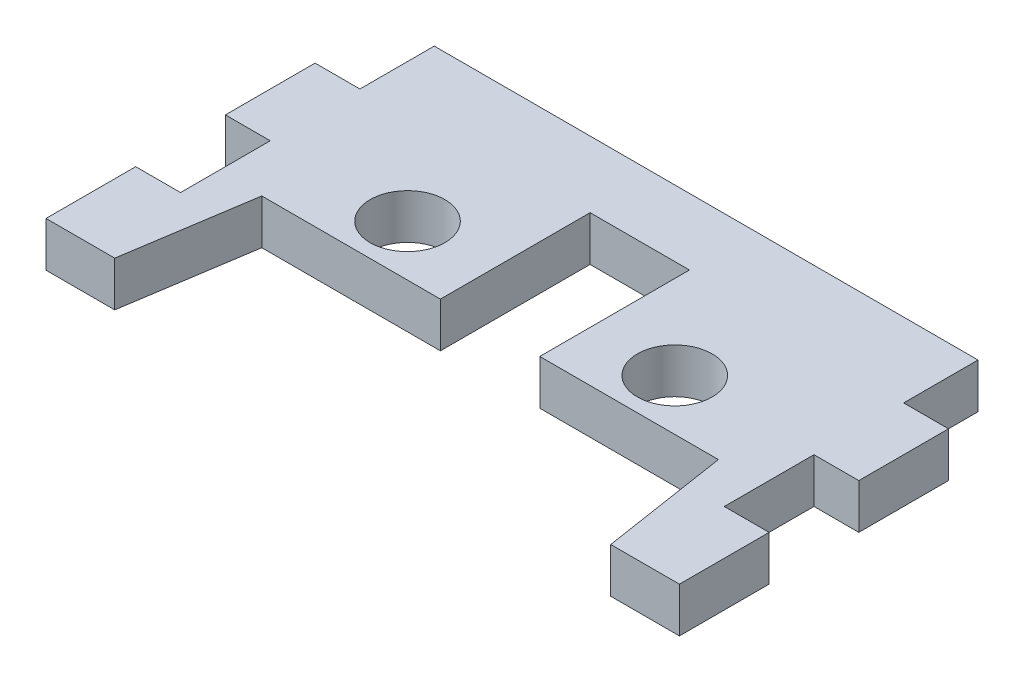
ISO-10303-21;
HEADER;
FILE_DESCRIPTION(('STEP AP214'),'2;1');
FILE_NAME('part.step','',(''),(''),'','','');
FILE_SCHEMA(('AUTOMOTIVE_DESIGN { 1 0 10303 214 1 1 1 1 }'));
ENDSEC;
DATA;
#1=APPLICATION_CONTEXT('core data for automotive mechanical design processes');
#2=APPLICATION_PROTOCOL_DEFINITION('international standard','automotive_design',2000,#1);
#3=PRODUCT_CONTEXT('',#1,'mechanical');
#4=PRODUCT('Part','Part','',(#3));
#5=PRODUCT_RELATED_PRODUCT_CATEGORY('part','',(#4));
#6=PRODUCT_DEFINITION_FORMATION('','',#4);
#7=PRODUCT_DEFINITION_CONTEXT('part definition',#1,'design');
#8=PRODUCT_DEFINITION('design','',#6,#7);
#9=PRODUCT_DEFINITION_SHAPE('','',#8);
#10=(LENGTH_UNIT() NAMED_UNIT(*) SI_UNIT(.MILLI.,.METRE.));
#11=(NAMED_UNIT(*) PLANE_ANGLE_UNIT() SI_UNIT($,.RADIAN.));
#12=(NAMED_UNIT(*) SI_UNIT($,.STERADIAN.) SOLID_ANGLE_UNIT());
#13=UNCERTAINTY_MEASURE_WITH_UNIT(LENGTH_MEASURE(1.E-05),#10,'distance_accuracy_value','');
#14=(GEOMETRIC_REPRESENTATION_CONTEXT(3) GLOBAL_UNCERTAINTY_ASSIGNED_CONTEXT((#13)) GLOBAL_UNIT_ASSIGNED_CONTEXT((#10,
#11,#12)) REPRESENTATION_CONTEXT('',''));
#15=CARTESIAN_POINT('',(0.,0.,0.));
#16=DIRECTION('',(0.,0.,1.));
#17=DIRECTION('',(1.,0.,0.));
#18=AXIS2_PLACEMENT_3D('',#15,#16,#17);
#19=CARTESIAN_POINT('',(0.,6.,0.));
#20=DIRECTION('',(0.,-1.,0.));
#21=DIRECTION('',(0.,0.,-1.));
#22=AXIS2_PLACEMENT_3D('',#19,#20,#21);
#23=PLANE('',#22);
#24=CARTESIAN_POINT('',(28.9745197224591,6.,-7.23783964696655));
#25=DIRECTION('',(0.,1.,0.));
#26=DIRECTION('',(0.,0.,1.));
#27=AXIS2_PLACEMENT_3D('',#24,#25,#26);
#28=CIRCLE('',#27,5.00000000000204);
#29=CARTESIAN_POINT('',(28.9745197224591,6.,-2.23783964696451));
#30=VERTEX_POINT('',#29);
#31=EDGE_CURVE('E232',#30,#30,#28,.T.);
#32=ORIENTED_EDGE('',*,*,#31,.F.);
#33=EDGE_LOOP('',(#32));
#34=FACE_BOUND('',#33,.T.);
#35=DIRECTION('',(0.152822724540484,0.,-0.988253618695132));
#36=VECTOR('',#35,1.);
#37=CARTESIAN_POINT('',(16.3085223788737,6.,-0.405693797705775));
#38=LINE('',#37,#36);
#39=CARTESIAN_POINT('',(13.6732789683899,6.,16.6355469234228));
#40=VERTEX_POINT('',#39);
#41=CARTESIAN_POINT('',(16.3085223788737,6.,-0.405693797705775));
#42=VERTEX_POINT('',#41);
#43=EDGE_CURVE('E275',#40,#42,#38,.T.);
#44=ORIENTED_EDGE('',*,*,#43,.T.);
#45=DIRECTION('',(1.,0.,0.));
#46=VECTOR('',#45,1.);
#47=CARTESIAN_POINT('',(40.2068590818868,6.,-0.405693797705778));
#48=LINE('',#47,#46);
#49=CARTESIAN_POINT('',(40.2068590818868,6.,-0.405693797705778));
#50=VERTEX_POINT('',#49);
#51=EDGE_CURVE('E143',#42,#50,#48,.T.);
#52=ORIENTED_EDGE('',*,*,#51,.T.);
#53=DIRECTION('',(0.,0.,-1.));
#54=VECTOR('',#53,1.);
#55=CARTESIAN_POINT('',(40.2068590818868,6.,-0.405693797705778));
#56=LINE('',#55,#54);
#57=CARTESIAN_POINT('',(40.2068590818868,6.,-20.432362651178));
#58=VERTEX_POINT('',#57);
#59=EDGE_CURVE('E338',#50,#58,#56,.T.);
#60=ORIENTED_EDGE('',*,*,#59,.T.);
#61=DIRECTION('',(1.,0.,0.));
#62=VECTOR('',#61,1.);
#63=CARTESIAN_POINT('',(40.2068590818868,6.,-20.432362651178));
#64=LINE('',#63,#62);
#65=CARTESIAN_POINT('',(53.4967784330314,6.,-20.432362651178));
#66=VERTEX_POINT('',#65);
#67=EDGE_CURVE('E357',#58,#66,#64,.T.);
#68=ORIENTED_EDGE('',*,*,#67,.T.);
#69=DIRECTION('',(0.,0.,1.));
#70=VECTOR('',#69,1.);
#71=CARTESIAN_POINT('',(53.4967784330314,6.,-0.405693797705778));
#72=LINE('',#71,#70);
#73=CARTESIAN_POINT('',(53.4967784330314,6.,-0.405693797705778));
#74=VERTEX_POINT('',#73);
#75=EDGE_CURVE('E354',#66,#74,#72,.T.);
#76=ORIENTED_EDGE('',*,*,#75,.T.);
#77=DIRECTION('',(1.,0.,0.));
#78=VECTOR('',#77,1.);
#79=CARTESIAN_POINT('',(77.3951151360445,6.,-0.405693797705775));
#80=LINE('',#79,#78);
#81=CARTESIAN_POINT('',(77.3951151360445,6.,-0.405693797705775));
#82=VERTEX_POINT('',#81);
#83=EDGE_CURVE('E356',#74,#82,#80,.T.);
#84=ORIENTED_EDGE('',*,*,#83,.T.);
#85=DIRECTION('',(0.152822724540484,0.,0.988253618695132));
#86=VECTOR('',#85,1.);
#87=CARTESIAN_POINT('',(80.0303585465283,6.,16.6355469234228));
#88=LINE('',#87,#86);
#89=CARTESIAN_POINT('',(80.0303585465283,6.,16.6355469234228));
#90=VERTEX_POINT('',#89);
#91=EDGE_CURVE('E359',#82,#90,#88,.T.);
#92=ORIENTED_EDGE('',*,*,#91,.T.);
#93=DIRECTION('',(1.,0.,0.));
#94=VECTOR('',#93,1.);
#95=CARTESIAN_POINT('',(89.2254004324377,6.,16.6355469234228));
#96=LINE('',#95,#94);
#97=CARTESIAN_POINT('',(89.2254004324377,6.,16.6355469234228));
#98=VERTEX_POINT('',#97);
#99=EDGE_CURVE('E365',#90,#98,#96,.T.);
#100=ORIENTED_EDGE('',*,*,#99,.T.);
#101=DIRECTION('',(0.,0.,-1.));
#102=VECTOR('',#101,1.);
#103=CARTESIAN_POINT('',(89.2254004324377,6.,4.63554692342285));
#104=LINE('',#103,#102);
#105=CARTESIAN_POINT('',(89.2254004324377,6.,4.63554692342285));
#106=VERTEX_POINT('',#105);
#107=EDGE_CURVE('E367',#98,#106,#104,.T.);
#108=ORIENTED_EDGE('',*,*,#107,.T.);
#109=DIRECTION('',(-1.,0.,0.));
#110=VECTOR('',#109,1.);
#111=CARTESIAN_POINT('',(83.2254004324591,6.,4.63554692342285));
#112=LINE('',#111,#110);
#113=CARTESIAN_POINT('',(83.2254004324591,6.,4.63554692342285));
#114=VERTEX_POINT('',#113);
#115=EDGE_CURVE('E369',#106,#114,#112,.T.);
#116=ORIENTED_EDGE('',*,*,#115,.T.);
#117=DIRECTION('',(0.,0.,-1.));
#118=VECTOR('',#117,1.);
#119=CARTESIAN_POINT('',(83.2254004324591,6.,-7.36445307657716));
#120=LINE('',#119,#118);
#121=CARTESIAN_POINT('',(83.2254004324591,6.,-7.36445307657716));
#122=VERTEX_POINT('',#121);
#123=EDGE_CURVE('E371',#114,#122,#120,.T.);
#124=ORIENTED_EDGE('',*,*,#123,.T.);
#125=DIRECTION('',(1.,0.,0.));
#126=VECTOR('',#125,1.);
#127=CARTESIAN_POINT('',(89.2254004324377,6.,-7.36445307657716));
#128=LINE('',#127,#126);
#129=CARTESIAN_POINT('',(89.2254004324377,6.,-7.36445307657716));
#130=VERTEX_POINT('',#129);
#131=EDGE_CURVE('E373',#122,#130,#128,.T.);
#132=ORIENTED_EDGE('',*,*,#131,.T.);
#133=DIRECTION('',(0.,0.,-1.));
#134=VECTOR('',#133,1.);
#135=CARTESIAN_POINT('',(89.2254004324377,6.,-7.36445307657716));
#136=LINE('',#135,#134);
#137=CARTESIAN_POINT('',(89.2254004324377,6.,-19.3644530765772));
#138=VERTEX_POINT('',#137);
#139=EDGE_CURVE('E375',#130,#138,#136,.T.);
#140=ORIENTED_EDGE('',*,*,#139,.T.);
#141=DIRECTION('',(-1.,0.,0.));
#142=VECTOR('',#141,1.);
#143=CARTESIAN_POINT('',(89.2254004324377,6.,-19.3644530765772));
#144=LINE('',#143,#142);
#145=CARTESIAN_POINT('',(83.2254004324591,6.,-19.3644530765772));
#146=VERTEX_POINT('',#145);
#147=EDGE_CURVE('E377',#138,#146,#144,.T.);
#148=ORIENTED_EDGE('',*,*,#147,.T.);
#149=DIRECTION('',(0.,0.,-1.));
#150=VECTOR('',#149,1.);
#151=CARTESIAN_POINT('',(83.2254004324591,6.,-19.3644530765772));
#152=LINE('',#151,#150);
#153=CARTESIAN_POINT('',(83.2254004324591,6.,-29.3111134765772));
#154=VERTEX_POINT('',#153);
#155=EDGE_CURVE('E379',#146,#154,#152,.T.);
#156=ORIENTED_EDGE('',*,*,#155,.T.);
#157=DIRECTION('',(-1.,0.,0.));
#158=VECTOR('',#157,1.);
#159=CARTESIAN_POINT('',(10.4782370824591,6.,-29.3111134765772));
#160=LINE('',#159,#158);
#161=CARTESIAN_POINT('',(10.4782370824591,6.,-29.3111134765772));
#162=VERTEX_POINT('',#161);
#163=EDGE_CURVE('E381',#154,#162,#160,.T.);
#164=ORIENTED_EDGE('',*,*,#163,.T.);
#165=DIRECTION('',(0.,0.,1.));
#166=VECTOR('',#165,1.);
#167=CARTESIAN_POINT('',(10.4782370824591,6.,-19.3644530765772));
#168=LINE('',#167,#166);
#169=CARTESIAN_POINT('',(10.4782370824591,6.,-19.3644530765772));
#170=VERTEX_POINT('',#169);
#171=EDGE_CURVE('E383',#162,#170,#168,.T.);
#172=ORIENTED_EDGE('',*,*,#171,.T.);
#173=DIRECTION('',(-1.,0.,0.));
#174=VECTOR('',#173,1.);
#175=CARTESIAN_POINT('',(4.47823708248052,6.,-19.3644530765772));
#176=LINE('',#175,#174);
#177=CARTESIAN_POINT('',(4.47823708248052,6.,-19.3644530765772));
#178=VERTEX_POINT('',#177);
#179=EDGE_CURVE('E385',#170,#178,#176,.T.);
#180=ORIENTED_EDGE('',*,*,#179,.T.);
#181=DIRECTION('',(0.,0.,1.));
#182=VECTOR('',#181,1.);
#183=CARTESIAN_POINT('',(4.47823708248052,6.,-7.36445307657715));
#184=LINE('',#183,#182);
#185=CARTESIAN_POINT('',(4.47823708248052,6.,-7.36445307657715));
#186=VERTEX_POINT('',#185);
#187=EDGE_CURVE('E387',#178,#186,#184,.T.);
#188=ORIENTED_EDGE('',*,*,#187,.T.);
#189=DIRECTION('',(1.,0.,0.));
#190=VECTOR('',#189,1.);
#191=CARTESIAN_POINT('',(10.4782370824591,6.,-7.36445307657715));
#192=LINE('',#191,#190);
#193=CARTESIAN_POINT('',(10.4782370824591,6.,-7.36445307657715));
#194=VERTEX_POINT('',#193);
#195=EDGE_CURVE('E389',#186,#194,#192,.T.);
#196=ORIENTED_EDGE('',*,*,#195,.T.);
#197=DIRECTION('',(0.,0.,1.));
#198=VECTOR('',#197,1.);
#199=CARTESIAN_POINT('',(10.4782370824591,6.,4.63554692342285));
#200=LINE('',#199,#198);
#201=CARTESIAN_POINT('',(10.4782370824591,6.,4.63554692342285));
#202=VERTEX_POINT('',#201);
#203=EDGE_CURVE('E210',#194,#202,#200,.T.);
#204=ORIENTED_EDGE('',*,*,#203,.T.);
#205=DIRECTION('',(-1.,0.,0.));
#206=VECTOR('',#205,1.);
#207=CARTESIAN_POINT('',(4.47823708248052,6.,4.63554692342285));
#208=LINE('',#207,#206);
#209=CARTESIAN_POINT('',(4.47823708248052,6.,4.63554692342285));
#210=VERTEX_POINT('',#209);
#211=EDGE_CURVE('E204',#202,#210,#208,.T.);
#212=ORIENTED_EDGE('',*,*,#211,.T.);
#213=DIRECTION('',(0.,0.,1.));
#214=VECTOR('',#213,1.);
#215=CARTESIAN_POINT('',(4.47823708248052,6.,16.6355469234228));
#216=LINE('',#215,#214);
#217=CARTESIAN_POINT('',(4.47823708248052,6.,16.6355469234228));
#218=VERTEX_POINT('',#217);
#219=EDGE_CURVE('E208',#210,#218,#216,.T.);
#220=ORIENTED_EDGE('',*,*,#219,.T.);
#221=DIRECTION('',(1.,0.,0.));
#222=VECTOR('',#221,1.);
#223=CARTESIAN_POINT('',(13.6732789683899,6.,16.6355469234228));
#224=LINE('',#223,#222);
#225=EDGE_CURVE('E52',#218,#40,#224,.T.);
#226=ORIENTED_EDGE('',*,*,#225,.T.);
#227=EDGE_LOOP('',(#44,#52,#60,#68,#76,#84,#92,#100,#108,#116,#124,#132,#140,#148,#156,#164,
#172,#180,#188,#196,#204,#212,#220,#226));
#228=FACE_BOUND('',#227,.T.);
#229=CARTESIAN_POINT('',(64.7291177924591,6.,-7.23783964696655));
#230=DIRECTION('',(0.,1.,0.));
#231=DIRECTION('',(0.,0.,1.));
#232=AXIS2_PLACEMENT_3D('',#229,#230,#231);
#233=CIRCLE('',#232,5.00000000000205);
#234=CARTESIAN_POINT('',(64.7291177924591,6.,-2.2378396469645));
#235=VERTEX_POINT('',#234);
#236=EDGE_CURVE('E432',#235,#235,#233,.T.);
#237=ORIENTED_EDGE('',*,*,#236,.F.);
#238=EDGE_LOOP('',(#237));
#239=FACE_BOUND('',#238,.T.);
#240=ADVANCED_FACE('F35',(#34,#228,#239),#23,.F.);
#241=CARTESIAN_POINT('',(0.,0.,0.));
#242=DIRECTION('',(0.,-1.,0.));
#243=DIRECTION('',(0.,0.,-1.));
#244=AXIS2_PLACEMENT_3D('',#241,#242,#243);
#245=PLANE('',#244);
#246=CARTESIAN_POINT('',(28.9745197224591,0.,-7.23783964696655));
#247=DIRECTION('',(0.,1.,0.));
#248=DIRECTION('',(0.,0.,1.));
#249=AXIS2_PLACEMENT_3D('',#246,#247,#248);
#250=CIRCLE('',#249,5.00000000000204);
#251=CARTESIAN_POINT('',(28.9745197224591,0.,-2.23783964696451));
#252=VERTEX_POINT('',#251);
#253=EDGE_CURVE('E437',#252,#252,#250,.T.);
#254=ORIENTED_EDGE('',*,*,#253,.T.);
#255=EDGE_LOOP('',(#254));
#256=FACE_BOUND('',#255,.T.);
#257=DIRECTION('',(0.152822724540484,0.,-0.988253618695132));
#258=VECTOR('',#257,1.);
#259=CARTESIAN_POINT('',(16.3085223788737,0.,-0.405693797705775));
#260=LINE('',#259,#258);
#261=CARTESIAN_POINT('',(13.6732789683899,0.,16.6355469234228));
#262=VERTEX_POINT('',#261);
#263=CARTESIAN_POINT('',(16.3085223788737,0.,-0.405693797705775));
#264=VERTEX_POINT('',#263);
#265=EDGE_CURVE('E228',#262,#264,#260,.T.);
#266=ORIENTED_EDGE('',*,*,#265,.F.);
#267=DIRECTION('',(1.,0.,0.));
#268=VECTOR('',#267,1.);
#269=CARTESIAN_POINT('',(13.6732789683899,0.,16.6355469234228));
#270=LINE('',#269,#268);
#271=CARTESIAN_POINT('',(4.47823708248052,0.,16.6355469234228));
#272=VERTEX_POINT('',#271);
#273=EDGE_CURVE('E135',#272,#262,#270,.T.);
#274=ORIENTED_EDGE('',*,*,#273,.F.);
#275=DIRECTION('',(0.,0.,1.));
#276=VECTOR('',#275,1.);
#277=CARTESIAN_POINT('',(4.47823708248052,0.,16.6355469234228));
#278=LINE('',#277,#276);
#279=CARTESIAN_POINT('',(4.47823708248052,0.,4.63554692342285));
#280=VERTEX_POINT('',#279);
#281=EDGE_CURVE('E129',#280,#272,#278,.T.);
#282=ORIENTED_EDGE('',*,*,#281,.F.);
#283=DIRECTION('',(-1.,0.,0.));
#284=VECTOR('',#283,1.);
#285=CARTESIAN_POINT('',(4.47823708248052,0.,4.63554692342285));
#286=LINE('',#285,#284);
#287=CARTESIAN_POINT('',(10.4782370824591,0.,4.63554692342285));
#288=VERTEX_POINT('',#287);
#289=EDGE_CURVE('E218',#288,#280,#286,.T.);
#290=ORIENTED_EDGE('',*,*,#289,.F.);
#291=DIRECTION('',(0.,0.,1.));
#292=VECTOR('',#291,1.);
#293=CARTESIAN_POINT('',(10.4782370824591,0.,4.63554692342285));
#294=LINE('',#293,#292);
#295=CARTESIAN_POINT('',(10.4782370824591,0.,-7.36445307657715));
#296=VERTEX_POINT('',#295);
#297=EDGE_CURVE('E270',#296,#288,#294,.T.);
#298=ORIENTED_EDGE('',*,*,#297,.F.);
#299=DIRECTION('',(1.,0.,0.));
#300=VECTOR('',#299,1.);
#301=CARTESIAN_POINT('',(10.4782370824591,0.,-7.36445307657715));
#302=LINE('',#301,#300);
#303=CARTESIAN_POINT('',(4.47823708248052,0.,-7.36445307657715));
#304=VERTEX_POINT('',#303);
#305=EDGE_CURVE('E268',#304,#296,#302,.T.);
#306=ORIENTED_EDGE('',*,*,#305,.F.);
#307=DIRECTION('',(0.,0.,1.));
#308=VECTOR('',#307,1.);
#309=CARTESIAN_POINT('',(4.47823708248052,0.,-7.36445307657715));
#310=LINE('',#309,#308);
#311=CARTESIAN_POINT('',(4.47823708248052,0.,-19.3644530765772));
#312=VERTEX_POINT('',#311);
#313=EDGE_CURVE('E266',#312,#304,#310,.T.);
#314=ORIENTED_EDGE('',*,*,#313,.F.);
#315=DIRECTION('',(-1.,0.,0.));
#316=VECTOR('',#315,1.);
#317=CARTESIAN_POINT('',(4.47823708248052,0.,-19.3644530765772));
#318=LINE('',#317,#316);
#319=CARTESIAN_POINT('',(10.4782370824591,0.,-19.3644530765772));
#320=VERTEX_POINT('',#319);
#321=EDGE_CURVE('E264',#320,#312,#318,.T.);
#322=ORIENTED_EDGE('',*,*,#321,.F.);
#323=DIRECTION('',(0.,0.,1.));
#324=VECTOR('',#323,1.);
#325=CARTESIAN_POINT('',(10.4782370824591,0.,-19.3644530765772));
#326=LINE('',#325,#324);
#327=CARTESIAN_POINT('',(10.4782370824591,0.,-29.3111134765772));
#328=VERTEX_POINT('',#327);
#329=EDGE_CURVE('E262',#328,#320,#326,.T.);
#330=ORIENTED_EDGE('',*,*,#329,.F.);
#331=DIRECTION('',(-1.,0.,0.));
#332=VECTOR('',#331,1.);
#333=CARTESIAN_POINT('',(10.4782370824591,0.,-29.3111134765772));
#334=LINE('',#333,#332);
#335=CARTESIAN_POINT('',(83.2254004324591,0.,-29.3111134765772));
#336=VERTEX_POINT('',#335);
#337=EDGE_CURVE('E260',#336,#328,#334,.T.);
#338=ORIENTED_EDGE('',*,*,#337,.F.);
#339=DIRECTION('',(0.,0.,-1.));
#340=VECTOR('',#339,1.);
#341=CARTESIAN_POINT('',(83.2254004324591,0.,-19.3644530765772));
#342=LINE('',#341,#340);
#343=CARTESIAN_POINT('',(83.2254004324591,0.,-19.3644530765772));
#344=VERTEX_POINT('',#343);
#345=EDGE_CURVE('E258',#344,#336,#342,.T.);
#346=ORIENTED_EDGE('',*,*,#345,.F.);
#347=DIRECTION('',(-1.,0.,0.));
#348=VECTOR('',#347,1.);
#349=CARTESIAN_POINT('',(89.2254004324377,0.,-19.3644530765772));
#350=LINE('',#349,#348);
#351=CARTESIAN_POINT('',(89.2254004324377,0.,-19.3644530765772));
#352=VERTEX_POINT('',#351);
#353=EDGE_CURVE('E256',#352,#344,#350,.T.);
#354=ORIENTED_EDGE('',*,*,#353,.F.);
#355=DIRECTION('',(0.,0.,-1.));
#356=VECTOR('',#355,1.);
#357=CARTESIAN_POINT('',(89.2254004324377,0.,-7.36445307657716));
#358=LINE('',#357,#356);
#359=CARTESIAN_POINT('',(89.2254004324377,0.,-7.36445307657716));
#360=VERTEX_POINT('',#359);
#361=EDGE_CURVE('E254',#360,#352,#358,.T.);
#362=ORIENTED_EDGE('',*,*,#361,.F.);
#363=DIRECTION('',(1.,0.,0.));
#364=VECTOR('',#363,1.);
#365=CARTESIAN_POINT('',(89.2254004324377,0.,-7.36445307657716));
#366=LINE('',#365,#364);
#367=CARTESIAN_POINT('',(83.2254004324591,0.,-7.36445307657716));
#368=VERTEX_POINT('',#367);
#369=EDGE_CURVE('E252',#368,#360,#366,.T.);
#370=ORIENTED_EDGE('',*,*,#369,.F.);
#371=DIRECTION('',(0.,0.,-1.));
#372=VECTOR('',#371,1.);
#373=CARTESIAN_POINT('',(83.2254004324591,0.,-7.36445307657716));
#374=LINE('',#373,#372);
#375=CARTESIAN_POINT('',(83.2254004324591,0.,4.63554692342285));
#376=VERTEX_POINT('',#375);
#377=EDGE_CURVE('E250',#376,#368,#374,.T.);
#378=ORIENTED_EDGE('',*,*,#377,.F.);
#379=DIRECTION('',(-1.,0.,0.));
#380=VECTOR('',#379,1.);
#381=CARTESIAN_POINT('',(83.2254004324591,0.,4.63554692342285));
#382=LINE('',#381,#380);
#383=CARTESIAN_POINT('',(89.2254004324377,0.,4.63554692342285));
#384=VERTEX_POINT('',#383);
#385=EDGE_CURVE('E248',#384,#376,#382,.T.);
#386=ORIENTED_EDGE('',*,*,#385,.F.);
#387=DIRECTION('',(0.,0.,-1.));
#388=VECTOR('',#387,1.);
#389=CARTESIAN_POINT('',(89.2254004324377,0.,4.63554692342285));
#390=LINE('',#389,#388);
#391=CARTESIAN_POINT('',(89.2254004324377,0.,16.6355469234228));
#392=VERTEX_POINT('',#391);
#393=EDGE_CURVE('E246',#392,#384,#390,.T.);
#394=ORIENTED_EDGE('',*,*,#393,.F.);
#395=DIRECTION('',(1.,0.,0.));
#396=VECTOR('',#395,1.);
#397=CARTESIAN_POINT('',(89.2254004324377,0.,16.6355469234228));
#398=LINE('',#397,#396);
#399=CARTESIAN_POINT('',(80.0303585465283,0.,16.6355469234228));
#400=VERTEX_POINT('',#399);
#401=EDGE_CURVE('E244',#400,#392,#398,.T.);
#402=ORIENTED_EDGE('',*,*,#401,.F.);
#403=DIRECTION('',(0.152822724540484,0.,0.988253618695132));
#404=VECTOR('',#403,1.);
#405=CARTESIAN_POINT('',(80.0303585465283,0.,16.6355469234228));
#406=LINE('',#405,#404);
#407=CARTESIAN_POINT('',(77.3951151360445,0.,-0.405693797705775));
#408=VERTEX_POINT('',#407);
#409=EDGE_CURVE('E242',#408,#400,#406,.T.);
#410=ORIENTED_EDGE('',*,*,#409,.F.);
#411=DIRECTION('',(1.,0.,0.));
#412=VECTOR('',#411,1.);
#413=CARTESIAN_POINT('',(77.3951151360445,0.,-0.405693797705775));
#414=LINE('',#413,#412);
#415=CARTESIAN_POINT('',(53.4967784330314,0.,-0.405693797705778));
#416=VERTEX_POINT('',#415);
#417=EDGE_CURVE('E240',#416,#408,#414,.T.);
#418=ORIENTED_EDGE('',*,*,#417,.F.);
#419=DIRECTION('',(0.,0.,1.));
#420=VECTOR('',#419,1.);
#421=CARTESIAN_POINT('',(53.4967784330314,0.,-0.405693797705778));
#422=LINE('',#421,#420);
#423=CARTESIAN_POINT('',(53.4967784330314,0.,-20.432362651178));
#424=VERTEX_POINT('',#423);
#425=EDGE_CURVE('E238',#424,#416,#422,.T.);
#426=ORIENTED_EDGE('',*,*,#425,.F.);
#427=DIRECTION('',(1.,0.,0.));
#428=VECTOR('',#427,1.);
#429=CARTESIAN_POINT('',(40.2068590818868,0.,-20.432362651178));
#430=LINE('',#429,#428);
#431=CARTESIAN_POINT('',(40.2068590818868,0.,-20.432362651178));
#432=VERTEX_POINT('',#431);
#433=EDGE_CURVE('E236',#432,#424,#430,.T.);
#434=ORIENTED_EDGE('',*,*,#433,.F.);
#435=DIRECTION('',(0.,0.,-1.));
#436=VECTOR('',#435,1.);
#437=CARTESIAN_POINT('',(40.2068590818868,0.,-0.405693797705778));
#438=LINE('',#437,#436);
#439=CARTESIAN_POINT('',(40.2068590818868,0.,-0.405693797705778));
#440=VERTEX_POINT('',#439);
#441=EDGE_CURVE('E234',#440,#432,#438,.T.);
#442=ORIENTED_EDGE('',*,*,#441,.F.);
#443=DIRECTION('',(1.,0.,0.));
#444=VECTOR('',#443,1.);
#445=CARTESIAN_POINT('',(40.2068590818868,0.,-0.405693797705778));
#446=LINE('',#445,#444);
#447=EDGE_CURVE('E231',#264,#440,#446,.T.);
#448=ORIENTED_EDGE('',*,*,#447,.F.);
#449=EDGE_LOOP('',(#266,#274,#282,#290,#298,#306,#314,#322,#330,#338,#346,#354,#362,#370,#378,
#386,#394,#402,#410,#418,#426,#434,#442,#448));
#450=FACE_BOUND('',#449,.T.);
#451=CARTESIAN_POINT('',(64.7291177924591,0.,-7.23783964696655));
#452=DIRECTION('',(0.,1.,0.));
#453=DIRECTION('',(0.,0.,1.));
#454=AXIS2_PLACEMENT_3D('',#451,#452,#453);
#455=CIRCLE('',#454,5.00000000000205);
#456=CARTESIAN_POINT('',(64.7291177924591,0.,-2.2378396469645));
#457=VERTEX_POINT('',#456);
#458=EDGE_CURVE('E435',#457,#457,#455,.T.);
#459=ORIENTED_EDGE('',*,*,#458,.T.);
#460=EDGE_LOOP('',(#459));
#461=FACE_BOUND('',#460,.T.);
#462=ADVANCED_FACE('F342',(#256,#450,#461),#245,.T.);
#463=CARTESIAN_POINT('',(16.3085223788737,6.,-0.405693797705775));
#464=DIRECTION('',(-0.988253618695132,0.,-0.152822724540484));
#465=DIRECTION('',(-0.152822724540484,0.,0.988253618695132));
#466=AXIS2_PLACEMENT_3D('',#463,#464,#465);
#467=PLANE('',#466);
#468=ORIENTED_EDGE('',*,*,#265,.T.);
#469=DIRECTION('',(0.,-1.,0.));
#470=VECTOR('',#469,1.);
#471=CARTESIAN_POINT('',(16.3085223788737,6.,-0.405693797705775));
#472=LINE('',#471,#470);
#473=EDGE_CURVE('E11',#42,#264,#472,.T.);
#474=ORIENTED_EDGE('',*,*,#473,.F.);
#475=ORIENTED_EDGE('',*,*,#43,.F.);
#476=DIRECTION('',(0.,-1.,0.));
#477=VECTOR('',#476,1.);
#478=CARTESIAN_POINT('',(13.6732789683899,6.,16.6355469234228));
#479=LINE('',#478,#477);
#480=EDGE_CURVE('E224',#40,#262,#479,.T.);
#481=ORIENTED_EDGE('',*,*,#480,.T.);
#482=EDGE_LOOP('',(#468,#474,#475,#481));
#483=FACE_BOUND('',#482,.T.);
#484=ADVANCED_FACE('F37',(#483),#467,.F.);
#485=CARTESIAN_POINT('',(40.2068590818868,6.,-0.405693797705778));
#486=DIRECTION('',(0.,0.,-1.));
#487=DIRECTION('',(-1.,0.,0.));
#488=AXIS2_PLACEMENT_3D('',#485,#486,#487);
#489=PLANE('',#488);
#490=ORIENTED_EDGE('',*,*,#447,.T.);
#491=DIRECTION('',(0.,-1.,0.));
#492=VECTOR('',#491,1.);
#493=CARTESIAN_POINT('',(40.2068590818868,6.,-0.405693797705778));
#494=LINE('',#493,#492);
#495=EDGE_CURVE('E44',#50,#440,#494,.T.);
#496=ORIENTED_EDGE('',*,*,#495,.F.);
#497=ORIENTED_EDGE('',*,*,#51,.F.);
#498=ORIENTED_EDGE('',*,*,#473,.T.);
#499=EDGE_LOOP('',(#490,#496,#497,#498));
#500=FACE_BOUND('',#499,.T.);
#501=ADVANCED_FACE('F650',(#500),#489,.F.);
#502=CARTESIAN_POINT('',(40.2068590818868,6.,-0.405693797705778));
#503=DIRECTION('',(-1.,0.,0.));
#504=DIRECTION('',(0.,0.,1.));
#505=AXIS2_PLACEMENT_3D('',#502,#503,#504);
#506=PLANE('',#505);
#507=ORIENTED_EDGE('',*,*,#441,.T.);
#508=DIRECTION('',(0.,-1.,0.));
#509=VECTOR('',#508,1.);
#510=CARTESIAN_POINT('',(40.2068590818868,6.,-20.432362651178));
#511=LINE('',#510,#509);
#512=EDGE_CURVE('E330',#58,#432,#511,.T.);
#513=ORIENTED_EDGE('',*,*,#512,.F.);
#514=ORIENTED_EDGE('',*,*,#59,.F.);
#515=ORIENTED_EDGE('',*,*,#495,.T.);
#516=EDGE_LOOP('',(#507,#513,#514,#515));
#517=FACE_BOUND('',#516,.T.);
#518=ADVANCED_FACE('F336',(#517),#506,.F.);
#519=CARTESIAN_POINT('',(40.2068590818868,6.,-20.432362651178));
#520=DIRECTION('',(0.,0.,-1.));
#521=DIRECTION('',(-1.,0.,0.));
#522=AXIS2_PLACEMENT_3D('',#519,#520,#521);
#523=PLANE('',#522);
#524=ORIENTED_EDGE('',*,*,#433,.T.);
#525=DIRECTION('',(0.,-1.,0.));
#526=VECTOR('',#525,1.);
#527=CARTESIAN_POINT('',(53.4967784330314,6.,-20.432362651178));
#528=LINE('',#527,#526);
#529=EDGE_CURVE('E327',#66,#424,#528,.T.);
#530=ORIENTED_EDGE('',*,*,#529,.F.);
#531=ORIENTED_EDGE('',*,*,#67,.F.);
#532=ORIENTED_EDGE('',*,*,#512,.T.);
#533=EDGE_LOOP('',(#524,#530,#531,#532));
#534=FACE_BOUND('',#533,.T.);
#535=ADVANCED_FACE('F348',(#534),#523,.F.);
#536=CARTESIAN_POINT('',(53.4967784330314,6.,-0.405693797705778));
#537=DIRECTION('',(1.,0.,0.));
#538=DIRECTION('',(0.,0.,-1.));
#539=AXIS2_PLACEMENT_3D('',#536,#537,#538);
#540=PLANE('',#539);
#541=ORIENTED_EDGE('',*,*,#425,.T.);
#542=DIRECTION('',(0.,-1.,0.));
#543=VECTOR('',#542,1.);
#544=CARTESIAN_POINT('',(53.4967784330314,6.,-0.405693797705778));
#545=LINE('',#544,#543);
#546=EDGE_CURVE('E324',#74,#416,#545,.T.);
#547=ORIENTED_EDGE('',*,*,#546,.F.);
#548=ORIENTED_EDGE('',*,*,#75,.F.);
#549=ORIENTED_EDGE('',*,*,#529,.T.);
#550=EDGE_LOOP('',(#541,#547,#548,#549));
#551=FACE_BOUND('',#550,.T.);
#552=ADVANCED_FACE('F352',(#551),#540,.F.);
#553=CARTESIAN_POINT('',(77.3951151360445,6.,-0.405693797705775));
#554=DIRECTION('',(0.,0.,-1.));
#555=DIRECTION('',(-1.,0.,0.));
#556=AXIS2_PLACEMENT_3D('',#553,#554,#555);
#557=PLANE('',#556);
#558=ORIENTED_EDGE('',*,*,#417,.T.);
#559=DIRECTION('',(0.,-1.,0.));
#560=VECTOR('',#559,1.);
#561=CARTESIAN_POINT('',(77.3951151360445,6.,-0.405693797705775));
#562=LINE('',#561,#560);
#563=EDGE_CURVE('E321',#82,#408,#562,.T.);
#564=ORIENTED_EDGE('',*,*,#563,.F.);
#565=ORIENTED_EDGE('',*,*,#83,.F.);
#566=ORIENTED_EDGE('',*,*,#546,.T.);
#567=EDGE_LOOP('',(#558,#564,#565,#566));
#568=FACE_BOUND('',#567,.T.);
#569=ADVANCED_FACE('F615',(#568),#557,.F.);
#570=CARTESIAN_POINT('',(80.0303585465283,6.,16.6355469234228));
#571=DIRECTION('',(0.988253618695132,0.,-0.152822724540484));
#572=DIRECTION('',(-0.152822724540484,0.,-0.988253618695132));
#573=AXIS2_PLACEMENT_3D('',#570,#571,#572);
#574=PLANE('',#573);
#575=ORIENTED_EDGE('',*,*,#409,.T.);
#576=DIRECTION('',(0.,-1.,0.));
#577=VECTOR('',#576,1.);
#578=CARTESIAN_POINT('',(80.0303585465283,6.,16.6355469234228));
#579=LINE('',#578,#577);
#580=EDGE_CURVE('E318',#90,#400,#579,.T.);
#581=ORIENTED_EDGE('',*,*,#580,.F.);
#582=ORIENTED_EDGE('',*,*,#91,.F.);
#583=ORIENTED_EDGE('',*,*,#563,.T.);
#584=EDGE_LOOP('',(#575,#581,#582,#583));
#585=FACE_BOUND('',#584,.T.);
#586=ADVANCED_FACE('F605',(#585),#574,.F.);
#587=CARTESIAN_POINT('',(89.2254004324377,6.,16.6355469234228));
#588=DIRECTION('',(0.,0.,-1.));
#589=DIRECTION('',(-1.,0.,0.));
#590=AXIS2_PLACEMENT_3D('',#587,#588,#589);
#591=PLANE('',#590);
#592=ORIENTED_EDGE('',*,*,#401,.T.);
#593=DIRECTION('',(0.,-1.,0.));
#594=VECTOR('',#593,1.);
#595=CARTESIAN_POINT('',(89.2254004324377,6.,16.6355469234228));
#596=LINE('',#595,#594);
#597=EDGE_CURVE('E315',#98,#392,#596,.T.);
#598=ORIENTED_EDGE('',*,*,#597,.F.);
#599=ORIENTED_EDGE('',*,*,#99,.F.);
#600=ORIENTED_EDGE('',*,*,#580,.T.);
#601=EDGE_LOOP('',(#592,#598,#599,#600));
#602=FACE_BOUND('',#601,.T.);
#603=ADVANCED_FACE('F595',(#602),#591,.F.);
#604=CARTESIAN_POINT('',(89.2254004324377,6.,4.63554692342285));
#605=DIRECTION('',(-1.,0.,0.));
#606=DIRECTION('',(0.,0.,1.));
#607=AXIS2_PLACEMENT_3D('',#604,#605,#606);
#608=PLANE('',#607);
#609=ORIENTED_EDGE('',*,*,#393,.T.);
#610=DIRECTION('',(0.,-1.,0.));
#611=VECTOR('',#610,1.);
#612=CARTESIAN_POINT('',(89.2254004324377,6.,4.63554692342285));
#613=LINE('',#612,#611);
#614=EDGE_CURVE('E312',#106,#384,#613,.T.);
#615=ORIENTED_EDGE('',*,*,#614,.F.);
#616=ORIENTED_EDGE('',*,*,#107,.F.);
#617=ORIENTED_EDGE('',*,*,#597,.T.);
#618=EDGE_LOOP('',(#609,#615,#616,#617));
#619=FACE_BOUND('',#618,.T.);
#620=ADVANCED_FACE('F585',(#619),#608,.F.);
#621=CARTESIAN_POINT('',(83.2254004324591,6.,4.63554692342285));
#622=DIRECTION('',(0.,0.,1.));
#623=DIRECTION('',(1.,0.,0.));
#624=AXIS2_PLACEMENT_3D('',#621,#622,#623);
#625=PLANE('',#624);
#626=ORIENTED_EDGE('',*,*,#385,.T.);
#627=DIRECTION('',(0.,-1.,0.));
#628=VECTOR('',#627,1.);
#629=CARTESIAN_POINT('',(83.2254004324591,6.,4.63554692342285));
#630=LINE('',#629,#628);
#631=EDGE_CURVE('E309',#114,#376,#630,.T.);
#632=ORIENTED_EDGE('',*,*,#631,.F.);
#633=ORIENTED_EDGE('',*,*,#115,.F.);
#634=ORIENTED_EDGE('',*,*,#614,.T.);
#635=EDGE_LOOP('',(#626,#632,#633,#634));
#636=FACE_BOUND('',#635,.T.);
#637=ADVANCED_FACE('F575',(#636),#625,.F.);
#638=CARTESIAN_POINT('',(83.2254004324591,6.,-7.36445307657716));
#639=DIRECTION('',(-1.,0.,0.));
#640=DIRECTION('',(0.,0.,1.));
#641=AXIS2_PLACEMENT_3D('',#638,#639,#640);
#642=PLANE('',#641);
#643=ORIENTED_EDGE('',*,*,#377,.T.);
#644=DIRECTION('',(0.,-1.,0.));
#645=VECTOR('',#644,1.);
#646=CARTESIAN_POINT('',(83.2254004324591,6.,-7.36445307657716));
#647=LINE('',#646,#645);
#648=EDGE_CURVE('E306',#122,#368,#647,.T.);
#649=ORIENTED_EDGE('',*,*,#648,.F.);
#650=ORIENTED_EDGE('',*,*,#123,.F.);
#651=ORIENTED_EDGE('',*,*,#631,.T.);
#652=EDGE_LOOP('',(#643,#649,#650,#651));
#653=FACE_BOUND('',#652,.T.);
#654=ADVANCED_FACE('F565',(#653),#642,.F.);
#655=CARTESIAN_POINT('',(89.2254004324377,6.,-7.36445307657716));
#656=DIRECTION('',(0.,0.,-1.));
#657=DIRECTION('',(-1.,0.,0.));
#658=AXIS2_PLACEMENT_3D('',#655,#656,#657);
#659=PLANE('',#658);
#660=ORIENTED_EDGE('',*,*,#369,.T.);
#661=DIRECTION('',(0.,-1.,0.));
#662=VECTOR('',#661,1.);
#663=CARTESIAN_POINT('',(89.2254004324377,6.,-7.36445307657716));
#664=LINE('',#663,#662);
#665=EDGE_CURVE('E303',#130,#360,#664,.T.);
#666=ORIENTED_EDGE('',*,*,#665,.F.);
#667=ORIENTED_EDGE('',*,*,#131,.F.);
#668=ORIENTED_EDGE('',*,*,#648,.T.);
#669=EDGE_LOOP('',(#660,#666,#667,#668));
#670=FACE_BOUND('',#669,.T.);
#671=ADVANCED_FACE('F555',(#670),#659,.F.);
#672=CARTESIAN_POINT('',(89.2254004324377,6.,-7.36445307657716));
#673=DIRECTION('',(-1.,0.,0.));
#674=DIRECTION('',(0.,0.,1.));
#675=AXIS2_PLACEMENT_3D('',#672,#673,#674);
#676=PLANE('',#675);
#677=ORIENTED_EDGE('',*,*,#361,.T.);
#678=DIRECTION('',(0.,-1.,0.));
#679=VECTOR('',#678,1.);
#680=CARTESIAN_POINT('',(89.2254004324377,6.,-19.3644530765772));
#681=LINE('',#680,#679);
#682=EDGE_CURVE('E300',#138,#352,#681,.T.);
#683=ORIENTED_EDGE('',*,*,#682,.F.);
#684=ORIENTED_EDGE('',*,*,#139,.F.);
#685=ORIENTED_EDGE('',*,*,#665,.T.);
#686=EDGE_LOOP('',(#677,#683,#684,#685));
#687=FACE_BOUND('',#686,.T.);
#688=ADVANCED_FACE('F545',(#687),#676,.F.);
#689=CARTESIAN_POINT('',(89.2254004324377,6.,-19.3644530765772));
#690=DIRECTION('',(0.,0.,1.));
#691=DIRECTION('',(1.,0.,0.));
#692=AXIS2_PLACEMENT_3D('',#689,#690,#691);
#693=PLANE('',#692);
#694=ORIENTED_EDGE('',*,*,#353,.T.);
#695=DIRECTION('',(0.,-1.,0.));
#696=VECTOR('',#695,1.);
#697=CARTESIAN_POINT('',(83.2254004324591,6.,-19.3644530765772));
#698=LINE('',#697,#696);
#699=EDGE_CURVE('E297',#146,#344,#698,.T.);
#700=ORIENTED_EDGE('',*,*,#699,.F.);
#701=ORIENTED_EDGE('',*,*,#147,.F.);
#702=ORIENTED_EDGE('',*,*,#682,.T.);
#703=EDGE_LOOP('',(#694,#700,#701,#702));
#704=FACE_BOUND('',#703,.T.);
#705=ADVANCED_FACE('F535',(#704),#693,.F.);
#706=CARTESIAN_POINT('',(83.2254004324591,6.,-19.3644530765772));
#707=DIRECTION('',(-1.,0.,0.));
#708=DIRECTION('',(0.,0.,1.));
#709=AXIS2_PLACEMENT_3D('',#706,#707,#708);
#710=PLANE('',#709);
#711=ORIENTED_EDGE('',*,*,#345,.T.);
#712=DIRECTION('',(0.,-1.,0.));
#713=VECTOR('',#712,1.);
#714=CARTESIAN_POINT('',(83.2254004324591,6.,-29.3111134765772));
#715=LINE('',#714,#713);
#716=EDGE_CURVE('E294',#154,#336,#715,.T.);
#717=ORIENTED_EDGE('',*,*,#716,.F.);
#718=ORIENTED_EDGE('',*,*,#155,.F.);
#719=ORIENTED_EDGE('',*,*,#699,.T.);
#720=EDGE_LOOP('',(#711,#717,#718,#719));
#721=FACE_BOUND('',#720,.T.);
#722=ADVANCED_FACE('F525',(#721),#710,.F.);
#723=CARTESIAN_POINT('',(10.4782370824591,6.,-29.3111134765772));
#724=DIRECTION('',(0.,0.,1.));
#725=DIRECTION('',(1.,0.,0.));
#726=AXIS2_PLACEMENT_3D('',#723,#724,#725);
#727=PLANE('',#726);
#728=ORIENTED_EDGE('',*,*,#337,.T.);
#729=DIRECTION('',(0.,-1.,0.));
#730=VECTOR('',#729,1.);
#731=CARTESIAN_POINT('',(10.4782370824591,6.,-29.3111134765772));
#732=LINE('',#731,#730);
#733=EDGE_CURVE('E291',#162,#328,#732,.T.);
#734=ORIENTED_EDGE('',*,*,#733,.F.);
#735=ORIENTED_EDGE('',*,*,#163,.F.);
#736=ORIENTED_EDGE('',*,*,#716,.T.);
#737=EDGE_LOOP('',(#728,#734,#735,#736));
#738=FACE_BOUND('',#737,.T.);
#739=ADVANCED_FACE('F515',(#738),#727,.F.);
#740=CARTESIAN_POINT('',(10.4782370824591,6.,-19.3644530765772));
#741=DIRECTION('',(1.,0.,0.));
#742=DIRECTION('',(0.,0.,-1.));
#743=AXIS2_PLACEMENT_3D('',#740,#741,#742);
#744=PLANE('',#743);
#745=ORIENTED_EDGE('',*,*,#329,.T.);
#746=DIRECTION('',(0.,-1.,0.));
#747=VECTOR('',#746,1.);
#748=CARTESIAN_POINT('',(10.4782370824591,6.,-19.3644530765772));
#749=LINE('',#748,#747);
#750=EDGE_CURVE('E288',#170,#320,#749,.T.);
#751=ORIENTED_EDGE('',*,*,#750,.F.);
#752=ORIENTED_EDGE('',*,*,#171,.F.);
#753=ORIENTED_EDGE('',*,*,#733,.T.);
#754=EDGE_LOOP('',(#745,#751,#752,#753));
#755=FACE_BOUND('',#754,.T.);
#756=ADVANCED_FACE('F505',(#755),#744,.F.);
#757=CARTESIAN_POINT('',(4.47823708248052,6.,-19.3644530765772));
#758=DIRECTION('',(0.,0.,1.));
#759=DIRECTION('',(1.,0.,0.));
#760=AXIS2_PLACEMENT_3D('',#757,#758,#759);
#761=PLANE('',#760);
#762=ORIENTED_EDGE('',*,*,#321,.T.);
#763=DIRECTION('',(0.,-1.,0.));
#764=VECTOR('',#763,1.);
#765=CARTESIAN_POINT('',(4.47823708248052,6.,-19.3644530765772));
#766=LINE('',#765,#764);
#767=EDGE_CURVE('E285',#178,#312,#766,.T.);
#768=ORIENTED_EDGE('',*,*,#767,.F.);
#769=ORIENTED_EDGE('',*,*,#179,.F.);
#770=ORIENTED_EDGE('',*,*,#750,.T.);
#771=EDGE_LOOP('',(#762,#768,#769,#770));
#772=FACE_BOUND('',#771,.T.);
#773=ADVANCED_FACE('F495',(#772),#761,.F.);
#774=CARTESIAN_POINT('',(4.47823708248052,6.,-7.36445307657715));
#775=DIRECTION('',(1.,0.,0.));
#776=DIRECTION('',(0.,0.,-1.));
#777=AXIS2_PLACEMENT_3D('',#774,#775,#776);
#778=PLANE('',#777);
#779=ORIENTED_EDGE('',*,*,#313,.T.);
#780=DIRECTION('',(0.,-1.,0.));
#781=VECTOR('',#780,1.);
#782=CARTESIAN_POINT('',(4.47823708248052,6.,-7.36445307657715));
#783=LINE('',#782,#781);
#784=EDGE_CURVE('E282',#186,#304,#783,.T.);
#785=ORIENTED_EDGE('',*,*,#784,.F.);
#786=ORIENTED_EDGE('',*,*,#187,.F.);
#787=ORIENTED_EDGE('',*,*,#767,.T.);
#788=EDGE_LOOP('',(#779,#785,#786,#787));
#789=FACE_BOUND('',#788,.T.);
#790=ADVANCED_FACE('F486',(#789),#778,.F.);
#791=CARTESIAN_POINT('',(10.4782370824591,6.,-7.36445307657715));
#792=DIRECTION('',(0.,0.,-1.));
#793=DIRECTION('',(-1.,0.,0.));
#794=AXIS2_PLACEMENT_3D('',#791,#792,#793);
#795=PLANE('',#794);
#796=ORIENTED_EDGE('',*,*,#305,.T.);
#797=DIRECTION('',(0.,-1.,0.));
#798=VECTOR('',#797,1.);
#799=CARTESIAN_POINT('',(10.4782370824591,6.,-7.36445307657715));
#800=LINE('',#799,#798);
#801=EDGE_CURVE('E279',#194,#296,#800,.T.);
#802=ORIENTED_EDGE('',*,*,#801,.F.);
#803=ORIENTED_EDGE('',*,*,#195,.F.);
#804=ORIENTED_EDGE('',*,*,#784,.T.);
#805=EDGE_LOOP('',(#796,#802,#803,#804));
#806=FACE_BOUND('',#805,.T.);
#807=ADVANCED_FACE('F395',(#806),#795,.F.);
#808=CARTESIAN_POINT('',(10.4782370824591,6.,4.63554692342285));
#809=DIRECTION('',(1.,0.,0.));
#810=DIRECTION('',(0.,0.,-1.));
#811=AXIS2_PLACEMENT_3D('',#808,#809,#810);
#812=PLANE('',#811);
#813=ORIENTED_EDGE('',*,*,#297,.T.);
#814=DIRECTION('',(0.,-1.,0.));
#815=VECTOR('',#814,1.);
#816=CARTESIAN_POINT('',(10.4782370824591,6.,4.63554692342285));
#817=LINE('',#816,#815);
#818=EDGE_CURVE('E219',#202,#288,#817,.T.);
#819=ORIENTED_EDGE('',*,*,#818,.F.);
#820=ORIENTED_EDGE('',*,*,#203,.F.);
#821=ORIENTED_EDGE('',*,*,#801,.T.);
#822=EDGE_LOOP('',(#813,#819,#820,#821));
#823=FACE_BOUND('',#822,.T.);
#824=ADVANCED_FACE('F399',(#823),#812,.F.);
#825=CARTESIAN_POINT('',(4.47823708248052,6.,4.63554692342285));
#826=DIRECTION('',(0.,0.,1.));
#827=DIRECTION('',(1.,0.,0.));
#828=AXIS2_PLACEMENT_3D('',#825,#826,#827);
#829=PLANE('',#828);
#830=ORIENTED_EDGE('',*,*,#289,.T.);
#831=DIRECTION('',(0.,-1.,0.));
#832=VECTOR('',#831,1.);
#833=CARTESIAN_POINT('',(4.47823708248052,6.,4.63554692342285));
#834=LINE('',#833,#832);
#835=EDGE_CURVE('E215',#210,#280,#834,.T.);
#836=ORIENTED_EDGE('',*,*,#835,.F.);
#837=ORIENTED_EDGE('',*,*,#211,.F.);
#838=ORIENTED_EDGE('',*,*,#818,.T.);
#839=EDGE_LOOP('',(#830,#836,#837,#838));
#840=FACE_BOUND('',#839,.T.);
#841=ADVANCED_FACE('F216',(#840),#829,.F.);
#842=CARTESIAN_POINT('',(4.47823708248052,6.,16.6355469234228));
#843=DIRECTION('',(1.,0.,0.));
#844=DIRECTION('',(0.,0.,-1.));
#845=AXIS2_PLACEMENT_3D('',#842,#843,#844);
#846=PLANE('',#845);
#847=ORIENTED_EDGE('',*,*,#281,.T.);
#848=DIRECTION('',(0.,-1.,0.));
#849=VECTOR('',#848,1.);
#850=CARTESIAN_POINT('',(4.47823708248052,6.,16.6355469234228));
#851=LINE('',#850,#849);
#852=EDGE_CURVE('E220',#218,#272,#851,.T.);
#853=ORIENTED_EDGE('',*,*,#852,.F.);
#854=ORIENTED_EDGE('',*,*,#219,.F.);
#855=ORIENTED_EDGE('',*,*,#835,.T.);
#856=EDGE_LOOP('',(#847,#853,#854,#855));
#857=FACE_BOUND('',#856,.T.);
#858=ADVANCED_FACE('F222',(#857),#846,.F.);
#859=CARTESIAN_POINT('',(13.6732789683899,6.,16.6355469234228));
#860=DIRECTION('',(0.,0.,-1.));
#861=DIRECTION('',(-1.,0.,0.));
#862=AXIS2_PLACEMENT_3D('',#859,#860,#861);
#863=PLANE('',#862);
#864=ORIENTED_EDGE('',*,*,#273,.T.);
#865=ORIENTED_EDGE('',*,*,#480,.F.);
#866=ORIENTED_EDGE('',*,*,#225,.F.);
#867=ORIENTED_EDGE('',*,*,#852,.T.);
#868=EDGE_LOOP('',(#864,#865,#866,#867));
#869=FACE_BOUND('',#868,.T.);
#870=ADVANCED_FACE('F403',(#869),#863,.F.);
#871=CARTESIAN_POINT('',(28.9745197224591,6.,-7.23783964696655));
#872=DIRECTION('',(0.,-1.,0.));
#873=DIRECTION('',(0.,0.,-1.));
#874=AXIS2_PLACEMENT_3D('',#871,#872,#873);
#875=CYLINDRICAL_SURFACE('',#874,5.00000000000204);
#876=ORIENTED_EDGE('',*,*,#31,.T.);
#877=EDGE_LOOP('',(#876));
#878=FACE_BOUND('',#877,.T.);
#879=ORIENTED_EDGE('',*,*,#253,.F.);
#880=EDGE_LOOP('',(#879));
#881=FACE_BOUND('',#880,.T.);
#882=ADVANCED_FACE('F405',(#878,#881),#875,.F.);
#883=CARTESIAN_POINT('',(64.7291177924591,6.,-7.23783964696655));
#884=DIRECTION('',(0.,-1.,0.));
#885=DIRECTION('',(0.,0.,-1.));
#886=AXIS2_PLACEMENT_3D('',#883,#884,#885);
#887=CYLINDRICAL_SURFACE('',#886,5.00000000000205);
#888=ORIENTED_EDGE('',*,*,#236,.T.);
#889=EDGE_LOOP('',(#888));
#890=FACE_BOUND('',#889,.T.);
#891=ORIENTED_EDGE('',*,*,#458,.F.);
#892=EDGE_LOOP('',(#891));
#893=FACE_BOUND('',#892,.T.);
#894=ADVANCED_FACE('F411',(#890,#893),#887,.F.);
#895=CLOSED_SHELL('',(#240,#462,#484,#501,#518,#535,#552,#569,#586,#603,#620,#637,#654,#671,
#688,#705,#722,#739,#756,#773,#790,#807,#824,#841,#858,#870,#882,#894));
#896=MANIFOLD_SOLID_BREP('B2',#895);
#897=ADVANCED_BREP_SHAPE_REPRESENTATION('',(#18,#896),#14);
#898=SHAPE_DEFINITION_REPRESENTATION(#9,#897);
ENDSEC;
END-ISO-10303-21;
